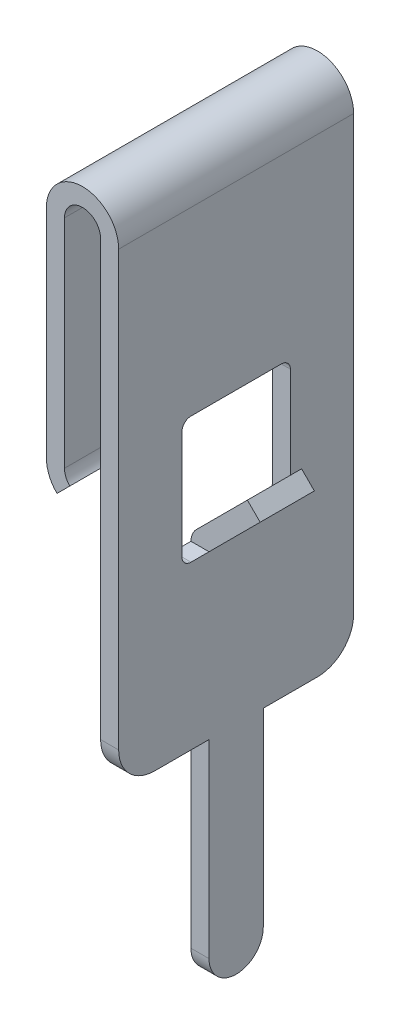
ISO-10303-21;
HEADER;
FILE_DESCRIPTION(('STEP AP214'),'2;1');
FILE_NAME('part.step','',(''),(''),'','','');
FILE_SCHEMA(('AUTOMOTIVE_DESIGN { 1 0 10303 214 1 1 1 1 }'));
ENDSEC;
DATA;
#1=APPLICATION_CONTEXT('core data for automotive mechanical design processes');
#2=APPLICATION_PROTOCOL_DEFINITION('international standard','automotive_design',2000,#1);
#3=PRODUCT_CONTEXT('',#1,'mechanical');
#4=PRODUCT('Part','Part','',(#3));
#5=PRODUCT_RELATED_PRODUCT_CATEGORY('part','',(#4));
#6=PRODUCT_DEFINITION_FORMATION('','',#4);
#7=PRODUCT_DEFINITION_CONTEXT('part definition',#1,'design');
#8=PRODUCT_DEFINITION('design','',#6,#7);
#9=PRODUCT_DEFINITION_SHAPE('','',#8);
#10=(LENGTH_UNIT() NAMED_UNIT(*) SI_UNIT(.MILLI.,.METRE.));
#11=(NAMED_UNIT(*) PLANE_ANGLE_UNIT() SI_UNIT($,.RADIAN.));
#12=(NAMED_UNIT(*) SI_UNIT($,.STERADIAN.) SOLID_ANGLE_UNIT());
#13=UNCERTAINTY_MEASURE_WITH_UNIT(LENGTH_MEASURE(1.E-05),#10,'distance_accuracy_value','');
#14=(GEOMETRIC_REPRESENTATION_CONTEXT(3) GLOBAL_UNCERTAINTY_ASSIGNED_CONTEXT((#13)) GLOBAL_UNIT_ASSIGNED_CONTEXT((#10,
#11,#12)) REPRESENTATION_CONTEXT('',''));
#15=CARTESIAN_POINT('',(0.,0.,0.));
#16=DIRECTION('',(0.,0.,1.));
#17=DIRECTION('',(1.,0.,0.));
#18=AXIS2_PLACEMENT_3D('',#15,#16,#17);
#19=CARTESIAN_POINT('',(0.,11.2071067811865,6.5));
#20=DIRECTION('',(-1.,0.,0.));
#21=DIRECTION('',(0.,-1.,0.));
#22=AXIS2_PLACEMENT_3D('',#19,#20,#21);
#23=PLANE('',#22);
#24=CARTESIAN_POINT('',(0.,7.,1.));
#25=DIRECTION('',(-1.,0.,0.));
#26=DIRECTION('',(0.,0.,1.));
#27=AXIS2_PLACEMENT_3D('',#24,#25,#26);
#28=CIRCLE('',#27,1.);
#29=CARTESIAN_POINT('',(0.,6.,1.));
#30=VERTEX_POINT('',#29);
#31=CARTESIAN_POINT('',(0.,7.,0.));
#32=VERTEX_POINT('',#31);
#33=EDGE_CURVE('E269',#30,#32,#28,.F.);
#34=ORIENTED_EDGE('',*,*,#33,.T.);
#35=DIRECTION('',(0.,1.,0.));
#36=VECTOR('',#35,1.);
#37=CARTESIAN_POINT('',(0.,11.2071067811865,0.));
#38=LINE('',#37,#36);
#39=CARTESIAN_POINT('',(0.,19.,0.));
#40=VERTEX_POINT('',#39);
#41=EDGE_CURVE('E274',#32,#40,#38,.T.);
#42=ORIENTED_EDGE('',*,*,#41,.T.);
#43=DIRECTION('',(0.,0.,-1.));
#44=VECTOR('',#43,1.);
#45=CARTESIAN_POINT('',(0.,19.,6.5));
#46=LINE('',#45,#44);
#47=CARTESIAN_POINT('',(0.,19.,6.5));
#48=VERTEX_POINT('',#47);
#49=EDGE_CURVE('E324',#48,#40,#46,.T.);
#50=ORIENTED_EDGE('',*,*,#49,.F.);
#51=DIRECTION('',(0.,1.,0.));
#52=VECTOR('',#51,1.);
#53=CARTESIAN_POINT('',(0.,11.2071067811865,6.5));
#54=LINE('',#53,#52);
#55=CARTESIAN_POINT('',(0.,7.,6.5));
#56=VERTEX_POINT('',#55);
#57=EDGE_CURVE('E365',#56,#48,#54,.T.);
#58=ORIENTED_EDGE('',*,*,#57,.F.);
#59=CARTESIAN_POINT('',(0.,7.,5.5));
#60=DIRECTION('',(-1.,0.,0.));
#61=DIRECTION('',(0.,0.,1.));
#62=AXIS2_PLACEMENT_3D('',#59,#60,#61);
#63=CIRCLE('',#62,1.);
#64=CARTESIAN_POINT('',(0.,6.,5.5));
#65=VERTEX_POINT('',#64);
#66=EDGE_CURVE('E383',#56,#65,#63,.F.);
#67=ORIENTED_EDGE('',*,*,#66,.T.);
#68=DIRECTION('',(0.,0.,-1.));
#69=VECTOR('',#68,1.);
#70=CARTESIAN_POINT('',(0.,6.,6.50000000000001));
#71=LINE('',#70,#69);
#72=CARTESIAN_POINT('',(0.,6.,4.));
#73=VERTEX_POINT('',#72);
#74=EDGE_CURVE('E424',#65,#73,#71,.T.);
#75=ORIENTED_EDGE('',*,*,#74,.T.);
#76=DIRECTION('',(0.,-1.,0.));
#77=VECTOR('',#76,1.);
#78=CARTESIAN_POINT('',(0.,0.,4.));
#79=LINE('',#78,#77);
#80=CARTESIAN_POINT('',(0.,0.749999999999999,4.));
#81=VERTEX_POINT('',#80);
#82=EDGE_CURVE('E420',#73,#81,#79,.T.);
#83=ORIENTED_EDGE('',*,*,#82,.T.);
#84=CARTESIAN_POINT('',(0.,0.749999999999999,3.25));
#85=DIRECTION('',(-1.,0.,0.));
#86=DIRECTION('',(0.,0.,1.));
#87=AXIS2_PLACEMENT_3D('',#84,#85,#86);
#88=CIRCLE('',#87,0.75);
#89=CARTESIAN_POINT('',(0.,0.749999999999999,2.5));
#90=VERTEX_POINT('',#89);
#91=EDGE_CURVE('E419',#81,#90,#88,.F.);
#92=ORIENTED_EDGE('',*,*,#91,.T.);
#93=DIRECTION('',(0.,1.,0.));
#94=VECTOR('',#93,1.);
#95=CARTESIAN_POINT('',(0.,0.,2.5));
#96=LINE('',#95,#94);
#97=CARTESIAN_POINT('',(0.,6.,2.5));
#98=VERTEX_POINT('',#97);
#99=EDGE_CURVE('E415',#90,#98,#96,.T.);
#100=ORIENTED_EDGE('',*,*,#99,.T.);
#101=DIRECTION('',(0.,0.,-1.));
#102=VECTOR('',#101,1.);
#103=CARTESIAN_POINT('',(0.,6.,6.49999999999999));
#104=LINE('',#103,#102);
#105=EDGE_CURVE('E380',#98,#30,#104,.T.);
#106=ORIENTED_EDGE('',*,*,#105,.T.);
#107=EDGE_LOOP('',(#34,#42,#50,#58,#67,#75,#83,#92,#100,#106));
#108=FACE_BOUND('',#107,.T.);
#109=DIRECTION('',(0.,0.,-1.));
#110=VECTOR('',#109,1.);
#111=CARTESIAN_POINT('',(0.,10.5,6.5));
#112=LINE('',#111,#110);
#113=CARTESIAN_POINT('',(0.,10.5,4.));
#114=VERTEX_POINT('',#113);
#115=CARTESIAN_POINT('',(0.,10.5,2.5));
#116=VERTEX_POINT('',#115);
#117=EDGE_CURVE('E242',#114,#116,#112,.T.);
#118=ORIENTED_EDGE('',*,*,#117,.F.);
#119=DIRECTION('',(0.,0.,-1.));
#120=VECTOR('',#119,1.);
#121=CARTESIAN_POINT('',(0.,10.5,3.25));
#122=LINE('',#121,#120);
#123=CARTESIAN_POINT('',(0.,10.5,4.5));
#124=VERTEX_POINT('',#123);
#125=EDGE_CURVE('E262',#124,#114,#122,.T.);
#126=ORIENTED_EDGE('',*,*,#125,.F.);
#127=CARTESIAN_POINT('',(0.,10.75,4.5));
#128=DIRECTION('',(1.,0.,0.));
#129=DIRECTION('',(0.,-1.,0.));
#130=AXIS2_PLACEMENT_3D('',#127,#128,#129);
#131=CIRCLE('',#130,0.25);
#132=CARTESIAN_POINT('',(0.,10.75,4.75));
#133=VERTEX_POINT('',#132);
#134=EDGE_CURVE('E498',#133,#124,#131,.T.);
#135=ORIENTED_EDGE('',*,*,#134,.F.);
#136=DIRECTION('',(0.,-1.,0.));
#137=VECTOR('',#136,1.);
#138=CARTESIAN_POINT('',(0.,10.75,4.75));
#139=LINE('',#138,#137);
#140=CARTESIAN_POINT('',(0.,13.75,4.75));
#141=VERTEX_POINT('',#140);
#142=EDGE_CURVE('E494',#141,#133,#139,.T.);
#143=ORIENTED_EDGE('',*,*,#142,.F.);
#144=CARTESIAN_POINT('',(0.,13.75,4.5));
#145=DIRECTION('',(1.,0.,0.));
#146=DIRECTION('',(0.,-1.,0.));
#147=AXIS2_PLACEMENT_3D('',#144,#145,#146);
#148=CIRCLE('',#147,0.25);
#149=CARTESIAN_POINT('',(0.,14.,4.5));
#150=VERTEX_POINT('',#149);
#151=EDGE_CURVE('E490',#150,#141,#148,.T.);
#152=ORIENTED_EDGE('',*,*,#151,.F.);
#153=DIRECTION('',(0.,0.,1.));
#154=VECTOR('',#153,1.);
#155=CARTESIAN_POINT('',(0.,14.,2.));
#156=LINE('',#155,#154);
#157=CARTESIAN_POINT('',(0.,14.,2.));
#158=VERTEX_POINT('',#157);
#159=EDGE_CURVE('E486',#158,#150,#156,.T.);
#160=ORIENTED_EDGE('',*,*,#159,.F.);
#161=CARTESIAN_POINT('',(0.,13.75,2.));
#162=DIRECTION('',(1.,0.,0.));
#163=DIRECTION('',(0.,1.,0.));
#164=AXIS2_PLACEMENT_3D('',#161,#162,#163);
#165=CIRCLE('',#164,0.25);
#166=CARTESIAN_POINT('',(0.,13.75,1.75));
#167=VERTEX_POINT('',#166);
#168=EDGE_CURVE('E482',#167,#158,#165,.T.);
#169=ORIENTED_EDGE('',*,*,#168,.F.);
#170=DIRECTION('',(0.,1.,0.));
#171=VECTOR('',#170,1.);
#172=CARTESIAN_POINT('',(0.,10.75,1.75));
#173=LINE('',#172,#171);
#174=CARTESIAN_POINT('',(0.,10.75,1.75));
#175=VERTEX_POINT('',#174);
#176=EDGE_CURVE('E478',#175,#167,#173,.T.);
#177=ORIENTED_EDGE('',*,*,#176,.F.);
#178=CARTESIAN_POINT('',(0.,10.75,2.));
#179=DIRECTION('',(1.,0.,0.));
#180=DIRECTION('',(0.,1.,0.));
#181=AXIS2_PLACEMENT_3D('',#178,#179,#180);
#182=CIRCLE('',#181,0.25);
#183=CARTESIAN_POINT('',(0.,10.5,2.));
#184=VERTEX_POINT('',#183);
#185=EDGE_CURVE('E257',#184,#175,#182,.T.);
#186=ORIENTED_EDGE('',*,*,#185,.F.);
#187=EDGE_CURVE('E254',#116,#184,#122,.T.);
#188=ORIENTED_EDGE('',*,*,#187,.F.);
#189=EDGE_LOOP('',(#118,#126,#135,#143,#152,#160,#169,#177,#186,#188));
#190=FACE_BOUND('',#189,.T.);
#191=ADVANCED_FACE('F39',(#108,#190),#23,.F.);
#192=CARTESIAN_POINT('',(-0.6,10.5,3.25));
#193=DIRECTION('',(0.,-1.,0.));
#194=DIRECTION('',(1.,0.,0.));
#195=AXIS2_PLACEMENT_3D('',#192,#193,#194);
#196=PLANE('',#195);
#197=DIRECTION('',(1.,0.,0.));
#198=VECTOR('',#197,1.);
#199=CARTESIAN_POINT('',(-0.5,10.5,2.5));
#200=LINE('',#199,#198);
#201=CARTESIAN_POINT('',(-0.5,10.5,2.5));
#202=VERTEX_POINT('',#201);
#203=EDGE_CURVE('E232',#202,#116,#200,.T.);
#204=ORIENTED_EDGE('',*,*,#203,.T.);
#205=ORIENTED_EDGE('',*,*,#187,.T.);
#206=DIRECTION('',(1.,0.,0.));
#207=VECTOR('',#206,1.);
#208=CARTESIAN_POINT('',(-0.6,10.5,2.));
#209=LINE('',#208,#207);
#210=CARTESIAN_POINT('',(-0.5,10.5,2.));
#211=VERTEX_POINT('',#210);
#212=EDGE_CURVE('E475',#211,#184,#209,.T.);
#213=ORIENTED_EDGE('',*,*,#212,.F.);
#214=DIRECTION('',(0.,0.,-1.));
#215=VECTOR('',#214,1.);
#216=CARTESIAN_POINT('',(-0.5,10.5,6.5));
#217=LINE('',#216,#215);
#218=EDGE_CURVE('E267',#202,#211,#217,.T.);
#219=ORIENTED_EDGE('',*,*,#218,.F.);
#220=EDGE_LOOP('',(#204,#205,#213,#219));
#221=FACE_BOUND('',#220,.T.);
#222=ADVANCED_FACE('F266',(#221),#196,.F.);
#223=DIRECTION('',(1.,0.,0.));
#224=VECTOR('',#223,1.);
#225=CARTESIAN_POINT('',(-0.5,10.5,4.));
#226=LINE('',#225,#224);
#227=CARTESIAN_POINT('',(-0.5,10.5,4.));
#228=VERTEX_POINT('',#227);
#229=EDGE_CURVE('E250',#228,#114,#226,.T.);
#230=ORIENTED_EDGE('',*,*,#229,.F.);
#231=CARTESIAN_POINT('',(-0.5,10.5,4.5));
#232=VERTEX_POINT('',#231);
#233=EDGE_CURVE('E309',#232,#228,#217,.T.);
#234=ORIENTED_EDGE('',*,*,#233,.F.);
#235=DIRECTION('',(1.,0.,0.));
#236=VECTOR('',#235,1.);
#237=CARTESIAN_POINT('',(-0.6,10.5,4.5));
#238=LINE('',#237,#236);
#239=EDGE_CURVE('E263',#232,#124,#238,.T.);
#240=ORIENTED_EDGE('',*,*,#239,.T.);
#241=ORIENTED_EDGE('',*,*,#125,.T.);
#242=EDGE_LOOP('',(#230,#234,#240,#241));
#243=FACE_BOUND('',#242,.T.);
#244=ADVANCED_FACE('F564',(#243),#196,.F.);
#245=CARTESIAN_POINT('',(-1.,19.,0.));
#246=DIRECTION('',(0.,0.,1.));
#247=DIRECTION('',(1.,0.,0.));
#248=AXIS2_PLACEMENT_3D('',#245,#246,#247);
#249=PLANE('',#248);
#250=ORIENTED_EDGE('',*,*,#41,.F.);
#251=DIRECTION('',(-1.,0.,0.));
#252=VECTOR('',#251,1.);
#253=CARTESIAN_POINT('',(1.5,7.,0.));
#254=LINE('',#253,#252);
#255=CARTESIAN_POINT('',(-0.5,7.,0.));
#256=VERTEX_POINT('',#255);
#257=EDGE_CURVE('E318',#256,#32,#254,.F.);
#258=ORIENTED_EDGE('',*,*,#257,.F.);
#259=DIRECTION('',(0.,-1.,0.));
#260=VECTOR('',#259,1.);
#261=CARTESIAN_POINT('',(-0.5,0.,0.));
#262=LINE('',#261,#260);
#263=CARTESIAN_POINT('',(-0.5,19.,0.));
#264=VERTEX_POINT('',#263);
#265=EDGE_CURVE('E361',#264,#256,#262,.T.);
#266=ORIENTED_EDGE('',*,*,#265,.F.);
#267=CARTESIAN_POINT('',(-1.,19.,0.));
#268=DIRECTION('',(0.,0.,-1.));
#269=DIRECTION('',(1.,0.,0.));
#270=AXIS2_PLACEMENT_3D('',#267,#268,#269);
#271=CIRCLE('',#270,0.5);
#272=CARTESIAN_POINT('',(-1.5,19.,0.));
#273=VERTEX_POINT('',#272);
#274=EDGE_CURVE('E354',#273,#264,#271,.T.);
#275=ORIENTED_EDGE('',*,*,#274,.F.);
#276=DIRECTION('',(0.,1.,0.));
#277=VECTOR('',#276,1.);
#278=CARTESIAN_POINT('',(-1.5,19.,0.));
#279=LINE('',#278,#277);
#280=CARTESIAN_POINT('',(-1.5,13.,0.));
#281=VERTEX_POINT('',#280);
#282=EDGE_CURVE('E349',#281,#273,#279,.T.);
#283=ORIENTED_EDGE('',*,*,#282,.F.);
#284=CARTESIAN_POINT('',(-1.,13.,0.));
#285=DIRECTION('',(0.,0.,-1.));
#286=DIRECTION('',(1.,0.,0.));
#287=AXIS2_PLACEMENT_3D('',#284,#285,#286);
#288=CIRCLE('',#287,0.499999999999999);
#289=CARTESIAN_POINT('',(-1.35355339059327,12.6464466094067,0.));
#290=VERTEX_POINT('',#289);
#291=EDGE_CURVE('E344',#290,#281,#288,.T.);
#292=ORIENTED_EDGE('',*,*,#291,.F.);
#293=DIRECTION('',(0.707106781186547,0.707106781186548,0.));
#294=VECTOR('',#293,1.);
#295=CARTESIAN_POINT('',(-1.70710678118655,12.2928932188135,0.));
#296=LINE('',#295,#294);
#297=CARTESIAN_POINT('',(-1.70710678118655,12.2928932188135,0.));
#298=VERTEX_POINT('',#297);
#299=EDGE_CURVE('E339',#298,#290,#296,.T.);
#300=ORIENTED_EDGE('',*,*,#299,.F.);
#301=CARTESIAN_POINT('',(-1.,13.,0.));
#302=DIRECTION('',(0.,0.,1.));
#303=DIRECTION('',(1.,0.,0.));
#304=AXIS2_PLACEMENT_3D('',#301,#302,#303);
#305=CIRCLE('',#304,0.999999999999999);
#306=CARTESIAN_POINT('',(-2.,13.,0.));
#307=VERTEX_POINT('',#306);
#308=EDGE_CURVE('E334',#307,#298,#305,.T.);
#309=ORIENTED_EDGE('',*,*,#308,.F.);
#310=DIRECTION('',(0.,-1.,0.));
#311=VECTOR('',#310,1.);
#312=CARTESIAN_POINT('',(-2.,19.,0.));
#313=LINE('',#312,#311);
#314=CARTESIAN_POINT('',(-2.,19.,0.));
#315=VERTEX_POINT('',#314);
#316=EDGE_CURVE('E328',#315,#307,#313,.T.);
#317=ORIENTED_EDGE('',*,*,#316,.F.);
#318=CARTESIAN_POINT('',(-1.,19.,0.));
#319=DIRECTION('',(0.,0.,1.));
#320=DIRECTION('',(1.,0.,0.));
#321=AXIS2_PLACEMENT_3D('',#318,#319,#320);
#322=CIRCLE('',#321,1.);
#323=EDGE_CURVE('E329',#40,#315,#322,.T.);
#324=ORIENTED_EDGE('',*,*,#323,.F.);
#325=EDGE_LOOP('',(#250,#258,#266,#275,#283,#292,#300,#309,#317,#324));
#326=FACE_BOUND('',#325,.T.);
#327=ADVANCED_FACE('F614',(#326),#249,.F.);
#328=CARTESIAN_POINT('',(-1.,19.,6.5));
#329=DIRECTION('',(0.,0.,-1.));
#330=DIRECTION('',(-1.,0.,0.));
#331=AXIS2_PLACEMENT_3D('',#328,#329,#330);
#332=CYLINDRICAL_SURFACE('',#331,1.);
#333=ORIENTED_EDGE('',*,*,#323,.T.);
#334=DIRECTION('',(0.,0.,-1.));
#335=VECTOR('',#334,1.);
#336=CARTESIAN_POINT('',(-2.,19.,6.5));
#337=LINE('',#336,#335);
#338=CARTESIAN_POINT('',(-2.,19.,6.5));
#339=VERTEX_POINT('',#338);
#340=EDGE_CURVE('E330',#339,#315,#337,.T.);
#341=ORIENTED_EDGE('',*,*,#340,.F.);
#342=CARTESIAN_POINT('',(-1.,19.,6.5));
#343=DIRECTION('',(0.,0.,1.));
#344=DIRECTION('',(1.,0.,0.));
#345=AXIS2_PLACEMENT_3D('',#342,#343,#344);
#346=CIRCLE('',#345,1.);
#347=EDGE_CURVE('E407',#48,#339,#346,.T.);
#348=ORIENTED_EDGE('',*,*,#347,.F.);
#349=ORIENTED_EDGE('',*,*,#49,.T.);
#350=EDGE_LOOP('',(#333,#341,#348,#349));
#351=FACE_BOUND('',#350,.T.);
#352=ADVANCED_FACE('F610',(#351),#332,.T.);
#353=CARTESIAN_POINT('',(-2.,19.,6.5));
#354=DIRECTION('',(1.,0.,0.));
#355=DIRECTION('',(0.,1.,0.));
#356=AXIS2_PLACEMENT_3D('',#353,#354,#355);
#357=PLANE('',#356);
#358=ORIENTED_EDGE('',*,*,#316,.T.);
#359=DIRECTION('',(0.,0.,-1.));
#360=VECTOR('',#359,1.);
#361=CARTESIAN_POINT('',(-2.,13.,6.5));
#362=LINE('',#361,#360);
#363=CARTESIAN_POINT('',(-2.,13.,6.5));
#364=VERTEX_POINT('',#363);
#365=EDGE_CURVE('E335',#364,#307,#362,.T.);
#366=ORIENTED_EDGE('',*,*,#365,.F.);
#367=DIRECTION('',(0.,-1.,0.));
#368=VECTOR('',#367,1.);
#369=CARTESIAN_POINT('',(-2.,19.,6.5));
#370=LINE('',#369,#368);
#371=EDGE_CURVE('E404',#339,#364,#370,.T.);
#372=ORIENTED_EDGE('',*,*,#371,.F.);
#373=ORIENTED_EDGE('',*,*,#340,.T.);
#374=EDGE_LOOP('',(#358,#366,#372,#373));
#375=FACE_BOUND('',#374,.T.);
#376=ADVANCED_FACE('F613',(#375),#357,.F.);
#377=CARTESIAN_POINT('',(-1.,13.,6.5));
#378=DIRECTION('',(0.,0.,-1.));
#379=DIRECTION('',(-1.,0.,0.));
#380=AXIS2_PLACEMENT_3D('',#377,#378,#379);
#381=CYLINDRICAL_SURFACE('',#380,0.999999999999999);
#382=ORIENTED_EDGE('',*,*,#308,.T.);
#383=DIRECTION('',(0.,0.,-1.));
#384=VECTOR('',#383,1.);
#385=CARTESIAN_POINT('',(-1.70710678118655,12.2928932188135,6.5));
#386=LINE('',#385,#384);
#387=CARTESIAN_POINT('',(-1.70710678118655,12.2928932188135,6.5));
#388=VERTEX_POINT('',#387);
#389=EDGE_CURVE('E340',#388,#298,#386,.T.);
#390=ORIENTED_EDGE('',*,*,#389,.F.);
#391=CARTESIAN_POINT('',(-1.,13.,6.5));
#392=DIRECTION('',(0.,0.,1.));
#393=DIRECTION('',(1.,0.,0.));
#394=AXIS2_PLACEMENT_3D('',#391,#392,#393);
#395=CIRCLE('',#394,0.999999999999999);
#396=EDGE_CURVE('E401',#364,#388,#395,.T.);
#397=ORIENTED_EDGE('',*,*,#396,.F.);
#398=ORIENTED_EDGE('',*,*,#365,.T.);
#399=EDGE_LOOP('',(#382,#390,#397,#398));
#400=FACE_BOUND('',#399,.T.);
#401=ADVANCED_FACE('F618',(#400),#381,.T.);
#402=CARTESIAN_POINT('',(-1.70710678118655,12.2928932188135,6.5));
#403=DIRECTION('',(-0.707106781186548,0.707106781186547,0.));
#404=DIRECTION('',(-0.707106781186547,-0.707106781186548,0.));
#405=AXIS2_PLACEMENT_3D('',#402,#403,#404);
#406=PLANE('',#405);
#407=ORIENTED_EDGE('',*,*,#299,.T.);
#408=DIRECTION('',(0.,0.,-1.));
#409=VECTOR('',#408,1.);
#410=CARTESIAN_POINT('',(-1.35355339059327,12.6464466094067,6.5));
#411=LINE('',#410,#409);
#412=CARTESIAN_POINT('',(-1.35355339059327,12.6464466094067,6.5));
#413=VERTEX_POINT('',#412);
#414=EDGE_CURVE('E345',#413,#290,#411,.T.);
#415=ORIENTED_EDGE('',*,*,#414,.F.);
#416=DIRECTION('',(0.707106781186547,0.707106781186548,0.));
#417=VECTOR('',#416,1.);
#418=CARTESIAN_POINT('',(-1.70710678118655,12.2928932188135,6.5));
#419=LINE('',#418,#417);
#420=EDGE_CURVE('E398',#388,#413,#419,.T.);
#421=ORIENTED_EDGE('',*,*,#420,.F.);
#422=ORIENTED_EDGE('',*,*,#389,.T.);
#423=EDGE_LOOP('',(#407,#415,#421,#422));
#424=FACE_BOUND('',#423,.T.);
#425=ADVANCED_FACE('F622',(#424),#406,.F.);
#426=CARTESIAN_POINT('',(-1.,13.,6.5));
#427=DIRECTION('',(0.,0.,-1.));
#428=DIRECTION('',(-1.,0.,0.));
#429=AXIS2_PLACEMENT_3D('',#426,#427,#428);
#430=CYLINDRICAL_SURFACE('',#429,0.499999999999999);
#431=ORIENTED_EDGE('',*,*,#291,.T.);
#432=DIRECTION('',(0.,0.,-1.));
#433=VECTOR('',#432,1.);
#434=CARTESIAN_POINT('',(-1.5,13.,6.5));
#435=LINE('',#434,#433);
#436=CARTESIAN_POINT('',(-1.5,13.,6.5));
#437=VERTEX_POINT('',#436);
#438=EDGE_CURVE('E350',#437,#281,#435,.T.);
#439=ORIENTED_EDGE('',*,*,#438,.F.);
#440=CARTESIAN_POINT('',(-1.,13.,6.5));
#441=DIRECTION('',(0.,0.,-1.));
#442=DIRECTION('',(1.,0.,0.));
#443=AXIS2_PLACEMENT_3D('',#440,#441,#442);
#444=CIRCLE('',#443,0.499999999999999);
#445=EDGE_CURVE('E395',#413,#437,#444,.T.);
#446=ORIENTED_EDGE('',*,*,#445,.F.);
#447=ORIENTED_EDGE('',*,*,#414,.T.);
#448=EDGE_LOOP('',(#431,#439,#446,#447));
#449=FACE_BOUND('',#448,.T.);
#450=ADVANCED_FACE('F626',(#449),#430,.F.);
#451=CARTESIAN_POINT('',(-1.5,19.,6.5));
#452=DIRECTION('',(-1.,0.,0.));
#453=DIRECTION('',(0.,-1.,0.));
#454=AXIS2_PLACEMENT_3D('',#451,#452,#453);
#455=PLANE('',#454);
#456=ORIENTED_EDGE('',*,*,#282,.T.);
#457=DIRECTION('',(0.,0.,-1.));
#458=VECTOR('',#457,1.);
#459=CARTESIAN_POINT('',(-1.5,19.,6.5));
#460=LINE('',#459,#458);
#461=CARTESIAN_POINT('',(-1.5,19.,6.5));
#462=VERTEX_POINT('',#461);
#463=EDGE_CURVE('E287',#462,#273,#460,.T.);
#464=ORIENTED_EDGE('',*,*,#463,.F.);
#465=DIRECTION('',(0.,1.,0.));
#466=VECTOR('',#465,1.);
#467=CARTESIAN_POINT('',(-1.5,19.,6.5));
#468=LINE('',#467,#466);
#469=EDGE_CURVE('E392',#437,#462,#468,.T.);
#470=ORIENTED_EDGE('',*,*,#469,.F.);
#471=ORIENTED_EDGE('',*,*,#438,.T.);
#472=EDGE_LOOP('',(#456,#464,#470,#471));
#473=FACE_BOUND('',#472,.T.);
#474=ADVANCED_FACE('F630',(#473),#455,.F.);
#475=CARTESIAN_POINT('',(-1.,19.,6.5));
#476=DIRECTION('',(0.,0.,-1.));
#477=DIRECTION('',(-1.,0.,0.));
#478=AXIS2_PLACEMENT_3D('',#475,#476,#477);
#479=CYLINDRICAL_SURFACE('',#478,0.5);
#480=ORIENTED_EDGE('',*,*,#274,.T.);
#481=DIRECTION('',(0.,0.,-1.));
#482=VECTOR('',#481,1.);
#483=CARTESIAN_POINT('',(-0.5,19.,6.5));
#484=LINE('',#483,#482);
#485=CARTESIAN_POINT('',(-0.5,19.,6.5));
#486=VERTEX_POINT('',#485);
#487=EDGE_CURVE('E292',#486,#264,#484,.T.);
#488=ORIENTED_EDGE('',*,*,#487,.F.);
#489=CARTESIAN_POINT('',(-1.,19.,6.5));
#490=DIRECTION('',(0.,0.,-1.));
#491=DIRECTION('',(1.,0.,0.));
#492=AXIS2_PLACEMENT_3D('',#489,#490,#491);
#493=CIRCLE('',#492,0.5);
#494=EDGE_CURVE('E389',#462,#486,#493,.T.);
#495=ORIENTED_EDGE('',*,*,#494,.F.);
#496=ORIENTED_EDGE('',*,*,#463,.T.);
#497=EDGE_LOOP('',(#480,#488,#495,#496));
#498=FACE_BOUND('',#497,.T.);
#499=ADVANCED_FACE('F634',(#498),#479,.F.);
#500=CARTESIAN_POINT('',(-0.5,0.,6.5));
#501=DIRECTION('',(1.,0.,0.));
#502=DIRECTION('',(0.,0.,-1.));
#503=AXIS2_PLACEMENT_3D('',#500,#501,#502);
#504=PLANE('',#503);
#505=ORIENTED_EDGE('',*,*,#233,.T.);
#506=DIRECTION('',(0.,0.,-1.));
#507=VECTOR('',#506,1.);
#508=CARTESIAN_POINT('',(-0.5,10.5,6.5));
#509=LINE('',#508,#507);
#510=EDGE_CURVE('E524',#228,#202,#509,.T.);
#511=ORIENTED_EDGE('',*,*,#510,.T.);
#512=ORIENTED_EDGE('',*,*,#218,.T.);
#513=CARTESIAN_POINT('',(-0.5,10.75,2.));
#514=DIRECTION('',(1.,0.,0.));
#515=DIRECTION('',(0.,0.,-1.));
#516=AXIS2_PLACEMENT_3D('',#513,#514,#515);
#517=CIRCLE('',#516,0.25);
#518=CARTESIAN_POINT('',(-0.5,10.75,1.75));
#519=VERTEX_POINT('',#518);
#520=EDGE_CURVE('E305',#211,#519,#517,.T.);
#521=ORIENTED_EDGE('',*,*,#520,.T.);
#522=DIRECTION('',(0.,1.,0.));
#523=VECTOR('',#522,1.);
#524=CARTESIAN_POINT('',(-0.5,0.,1.75));
#525=LINE('',#524,#523);
#526=CARTESIAN_POINT('',(-0.5,13.75,1.75));
#527=VERTEX_POINT('',#526);
#528=EDGE_CURVE('E301',#519,#527,#525,.T.);
#529=ORIENTED_EDGE('',*,*,#528,.T.);
#530=CARTESIAN_POINT('',(-0.5,13.75,2.));
#531=DIRECTION('',(1.,0.,0.));
#532=DIRECTION('',(0.,0.,-1.));
#533=AXIS2_PLACEMENT_3D('',#530,#531,#532);
#534=CIRCLE('',#533,0.25);
#535=CARTESIAN_POINT('',(-0.5,14.,2.));
#536=VERTEX_POINT('',#535);
#537=EDGE_CURVE('E297',#527,#536,#534,.T.);
#538=ORIENTED_EDGE('',*,*,#537,.T.);
#539=DIRECTION('',(0.,0.,1.));
#540=VECTOR('',#539,1.);
#541=CARTESIAN_POINT('',(-0.5,14.,6.5));
#542=LINE('',#541,#540);
#543=CARTESIAN_POINT('',(-0.5,14.,4.5));
#544=VERTEX_POINT('',#543);
#545=EDGE_CURVE('E293',#536,#544,#542,.T.);
#546=ORIENTED_EDGE('',*,*,#545,.T.);
#547=CARTESIAN_POINT('',(-0.5,13.75,4.5));
#548=DIRECTION('',(1.,0.,0.));
#549=DIRECTION('',(0.,0.,-1.));
#550=AXIS2_PLACEMENT_3D('',#547,#548,#549);
#551=CIRCLE('',#550,0.25);
#552=CARTESIAN_POINT('',(-0.5,13.75,4.75));
#553=VERTEX_POINT('',#552);
#554=EDGE_CURVE('E288',#544,#553,#551,.T.);
#555=ORIENTED_EDGE('',*,*,#554,.T.);
#556=DIRECTION('',(0.,-1.,0.));
#557=VECTOR('',#556,1.);
#558=CARTESIAN_POINT('',(-0.5,0.,4.75));
#559=LINE('',#558,#557);
#560=CARTESIAN_POINT('',(-0.5,10.75,4.75));
#561=VERTEX_POINT('',#560);
#562=EDGE_CURVE('E283',#553,#561,#559,.T.);
#563=ORIENTED_EDGE('',*,*,#562,.T.);
#564=CARTESIAN_POINT('',(-0.5,10.75,4.5));
#565=DIRECTION('',(1.,0.,0.));
#566=DIRECTION('',(0.,0.,-1.));
#567=AXIS2_PLACEMENT_3D('',#564,#565,#566);
#568=CIRCLE('',#567,0.25);
#569=EDGE_CURVE('E279',#561,#232,#568,.T.);
#570=ORIENTED_EDGE('',*,*,#569,.T.);
#571=EDGE_LOOP('',(#505,#511,#512,#521,#529,#538,#546,#555,#563,#570));
#572=FACE_BOUND('',#571,.T.);
#573=DIRECTION('',(0.,0.,-1.));
#574=VECTOR('',#573,1.);
#575=CARTESIAN_POINT('',(-0.5,6.,4.));
#576=LINE('',#575,#574);
#577=CARTESIAN_POINT('',(-0.5,6.,5.5));
#578=VERTEX_POINT('',#577);
#579=CARTESIAN_POINT('',(-0.5,6.,4.));
#580=VERTEX_POINT('',#579);
#581=EDGE_CURVE('E436',#578,#580,#576,.T.);
#582=ORIENTED_EDGE('',*,*,#581,.F.);
#583=CARTESIAN_POINT('',(-0.5,7.,5.5));
#584=DIRECTION('',(1.,0.,0.));
#585=DIRECTION('',(0.,0.,1.));
#586=AXIS2_PLACEMENT_3D('',#583,#584,#585);
#587=CIRCLE('',#586,1.);
#588=CARTESIAN_POINT('',(-0.5,7.,6.5));
#589=VERTEX_POINT('',#588);
#590=EDGE_CURVE('E316',#589,#578,#587,.T.);
#591=ORIENTED_EDGE('',*,*,#590,.F.);
#592=DIRECTION('',(0.,-1.,0.));
#593=VECTOR('',#592,1.);
#594=CARTESIAN_POINT('',(-0.5,0.,6.5));
#595=LINE('',#594,#593);
#596=EDGE_CURVE('E384',#486,#589,#595,.T.);
#597=ORIENTED_EDGE('',*,*,#596,.F.);
#598=ORIENTED_EDGE('',*,*,#487,.T.);
#599=ORIENTED_EDGE('',*,*,#265,.T.);
#600=CARTESIAN_POINT('',(-0.5,7.,1.));
#601=DIRECTION('',(1.,0.,0.));
#602=DIRECTION('',(0.,0.,1.));
#603=AXIS2_PLACEMENT_3D('',#600,#601,#602);
#604=CIRCLE('',#603,1.);
#605=CARTESIAN_POINT('',(-0.5,6.,1.));
#606=VERTEX_POINT('',#605);
#607=EDGE_CURVE('E323',#606,#256,#604,.T.);
#608=ORIENTED_EDGE('',*,*,#607,.F.);
#609=DIRECTION('',(0.,0.,-1.));
#610=VECTOR('',#609,1.);
#611=CARTESIAN_POINT('',(-0.5,6.,1.));
#612=LINE('',#611,#610);
#613=CARTESIAN_POINT('',(-0.5,6.,2.5));
#614=VERTEX_POINT('',#613);
#615=EDGE_CURVE('E449',#614,#606,#612,.T.);
#616=ORIENTED_EDGE('',*,*,#615,.F.);
#617=DIRECTION('',(0.,1.,0.));
#618=VECTOR('',#617,1.);
#619=CARTESIAN_POINT('',(-0.5,0.749999999999999,2.5));
#620=LINE('',#619,#618);
#621=CARTESIAN_POINT('',(-0.5,0.749999999999999,2.5));
#622=VERTEX_POINT('',#621);
#623=EDGE_CURVE('E441',#622,#614,#620,.T.);
#624=ORIENTED_EDGE('',*,*,#623,.F.);
#625=CARTESIAN_POINT('',(-0.5,0.749999999999999,3.25));
#626=DIRECTION('',(1.,0.,0.));
#627=DIRECTION('',(0.,0.,1.));
#628=AXIS2_PLACEMENT_3D('',#625,#626,#627);
#629=CIRCLE('',#628,0.75);
#630=CARTESIAN_POINT('',(-0.5,0.749999999999999,4.));
#631=VERTEX_POINT('',#630);
#632=EDGE_CURVE('E317',#631,#622,#629,.T.);
#633=ORIENTED_EDGE('',*,*,#632,.F.);
#634=DIRECTION('',(0.,-1.,0.));
#635=VECTOR('',#634,1.);
#636=CARTESIAN_POINT('',(-0.5,0.749999999999999,4.));
#637=LINE('',#636,#635);
#638=EDGE_CURVE('E437',#580,#631,#637,.T.);
#639=ORIENTED_EDGE('',*,*,#638,.F.);
#640=EDGE_LOOP('',(#582,#591,#597,#598,#599,#608,#616,#624,#633,#639));
#641=FACE_BOUND('',#640,.T.);
#642=ADVANCED_FACE('F532',(#572,#641),#504,.F.);
#643=CARTESIAN_POINT('',(-1.,19.,6.5));
#644=DIRECTION('',(0.,0.,1.));
#645=DIRECTION('',(1.,0.,0.));
#646=AXIS2_PLACEMENT_3D('',#643,#644,#645);
#647=PLANE('',#646);
#648=DIRECTION('',(-1.,0.,0.));
#649=VECTOR('',#648,1.);
#650=CARTESIAN_POINT('',(-1.,7.,6.5));
#651=LINE('',#650,#649);
#652=EDGE_CURVE('E313',#56,#589,#651,.T.);
#653=ORIENTED_EDGE('',*,*,#652,.F.);
#654=ORIENTED_EDGE('',*,*,#57,.T.);
#655=ORIENTED_EDGE('',*,*,#347,.T.);
#656=ORIENTED_EDGE('',*,*,#371,.T.);
#657=ORIENTED_EDGE('',*,*,#396,.T.);
#658=ORIENTED_EDGE('',*,*,#420,.T.);
#659=ORIENTED_EDGE('',*,*,#445,.T.);
#660=ORIENTED_EDGE('',*,*,#469,.T.);
#661=ORIENTED_EDGE('',*,*,#494,.T.);
#662=ORIENTED_EDGE('',*,*,#596,.T.);
#663=EDGE_LOOP('',(#653,#654,#655,#656,#657,#658,#659,#660,#661,#662));
#664=FACE_BOUND('',#663,.T.);
#665=ADVANCED_FACE('F641',(#664),#647,.T.);
#666=CARTESIAN_POINT('',(1.5,6.,1.));
#667=DIRECTION('',(0.,1.,0.));
#668=DIRECTION('',(0.,0.,1.));
#669=AXIS2_PLACEMENT_3D('',#666,#667,#668);
#670=PLANE('',#669);
#671=DIRECTION('',(-1.,0.,0.));
#672=VECTOR('',#671,1.);
#673=CARTESIAN_POINT('',(1.5,6.,2.5));
#674=LINE('',#673,#672);
#675=EDGE_CURVE('E388',#98,#614,#674,.T.);
#676=ORIENTED_EDGE('',*,*,#675,.T.);
#677=ORIENTED_EDGE('',*,*,#615,.T.);
#678=DIRECTION('',(-1.,0.,0.));
#679=VECTOR('',#678,1.);
#680=CARTESIAN_POINT('',(1.5,6.,1.));
#681=LINE('',#680,#679);
#682=EDGE_CURVE('E452',#30,#606,#681,.T.);
#683=ORIENTED_EDGE('',*,*,#682,.F.);
#684=ORIENTED_EDGE('',*,*,#105,.F.);
#685=EDGE_LOOP('',(#676,#677,#683,#684));
#686=FACE_BOUND('',#685,.T.);
#687=ADVANCED_FACE('F647',(#686),#670,.F.);
#688=CARTESIAN_POINT('',(1.5,0.749999999999999,2.5));
#689=DIRECTION('',(0.,0.,1.));
#690=DIRECTION('',(1.,0.,0.));
#691=AXIS2_PLACEMENT_3D('',#688,#689,#690);
#692=PLANE('',#691);
#693=DIRECTION('',(-1.,0.,0.));
#694=VECTOR('',#693,1.);
#695=CARTESIAN_POINT('',(1.5,0.749999999999999,2.5));
#696=LINE('',#695,#694);
#697=EDGE_CURVE('E446',#90,#622,#696,.T.);
#698=ORIENTED_EDGE('',*,*,#697,.T.);
#699=ORIENTED_EDGE('',*,*,#623,.T.);
#700=ORIENTED_EDGE('',*,*,#675,.F.);
#701=ORIENTED_EDGE('',*,*,#99,.F.);
#702=EDGE_LOOP('',(#698,#699,#700,#701));
#703=FACE_BOUND('',#702,.T.);
#704=ADVANCED_FACE('F662',(#703),#692,.F.);
#705=CARTESIAN_POINT('',(1.5,0.749999999999999,4.));
#706=DIRECTION('',(0.,0.,-1.));
#707=DIRECTION('',(-1.,0.,0.));
#708=AXIS2_PLACEMENT_3D('',#705,#706,#707);
#709=PLANE('',#708);
#710=DIRECTION('',(-1.,0.,0.));
#711=VECTOR('',#710,1.);
#712=CARTESIAN_POINT('',(1.5,6.,4.));
#713=LINE('',#712,#711);
#714=EDGE_CURVE('E438',#73,#580,#713,.T.);
#715=ORIENTED_EDGE('',*,*,#714,.T.);
#716=ORIENTED_EDGE('',*,*,#638,.T.);
#717=DIRECTION('',(-1.,0.,0.));
#718=VECTOR('',#717,1.);
#719=CARTESIAN_POINT('',(1.5,0.749999999999999,4.));
#720=LINE('',#719,#718);
#721=EDGE_CURVE('E442',#81,#631,#720,.T.);
#722=ORIENTED_EDGE('',*,*,#721,.F.);
#723=ORIENTED_EDGE('',*,*,#82,.F.);
#724=EDGE_LOOP('',(#715,#716,#722,#723));
#725=FACE_BOUND('',#724,.T.);
#726=ADVANCED_FACE('F658',(#725),#709,.F.);
#727=CARTESIAN_POINT('',(1.5,6.,4.));
#728=DIRECTION('',(0.,1.,0.));
#729=DIRECTION('',(0.,0.,1.));
#730=AXIS2_PLACEMENT_3D('',#727,#728,#729);
#731=PLANE('',#730);
#732=DIRECTION('',(-1.,0.,0.));
#733=VECTOR('',#732,1.);
#734=CARTESIAN_POINT('',(1.5,6.,5.5));
#735=LINE('',#734,#733);
#736=EDGE_CURVE('E433',#65,#578,#735,.T.);
#737=ORIENTED_EDGE('',*,*,#736,.T.);
#738=ORIENTED_EDGE('',*,*,#581,.T.);
#739=ORIENTED_EDGE('',*,*,#714,.F.);
#740=ORIENTED_EDGE('',*,*,#74,.F.);
#741=EDGE_LOOP('',(#737,#738,#739,#740));
#742=FACE_BOUND('',#741,.T.);
#743=ADVANCED_FACE('F655',(#742),#731,.F.);
#744=CARTESIAN_POINT('',(1.5,0.749999999999999,3.25));
#745=DIRECTION('',(-1.,0.,0.));
#746=DIRECTION('',(0.,0.,1.));
#747=AXIS2_PLACEMENT_3D('',#744,#745,#746);
#748=CYLINDRICAL_SURFACE('',#747,0.75);
#749=ORIENTED_EDGE('',*,*,#721,.T.);
#750=ORIENTED_EDGE('',*,*,#632,.T.);
#751=ORIENTED_EDGE('',*,*,#697,.F.);
#752=ORIENTED_EDGE('',*,*,#91,.F.);
#753=EDGE_LOOP('',(#749,#750,#751,#752));
#754=FACE_BOUND('',#753,.T.);
#755=ADVANCED_FACE('F653',(#754),#748,.T.);
#756=CARTESIAN_POINT('',(1.5,7.,5.5));
#757=DIRECTION('',(-1.,0.,0.));
#758=DIRECTION('',(0.,0.,1.));
#759=AXIS2_PLACEMENT_3D('',#756,#757,#758);
#760=CYLINDRICAL_SURFACE('',#759,1.);
#761=ORIENTED_EDGE('',*,*,#652,.T.);
#762=ORIENTED_EDGE('',*,*,#590,.T.);
#763=ORIENTED_EDGE('',*,*,#736,.F.);
#764=ORIENTED_EDGE('',*,*,#66,.F.);
#765=EDGE_LOOP('',(#761,#762,#763,#764));
#766=FACE_BOUND('',#765,.T.);
#767=ADVANCED_FACE('F649',(#766),#760,.T.);
#768=CARTESIAN_POINT('',(1.5,7.,1.));
#769=DIRECTION('',(-1.,0.,0.));
#770=DIRECTION('',(0.,0.,1.));
#771=AXIS2_PLACEMENT_3D('',#768,#769,#770);
#772=CYLINDRICAL_SURFACE('',#771,1.);
#773=ORIENTED_EDGE('',*,*,#682,.T.);
#774=ORIENTED_EDGE('',*,*,#607,.T.);
#775=ORIENTED_EDGE('',*,*,#257,.T.);
#776=ORIENTED_EDGE('',*,*,#33,.F.);
#777=EDGE_LOOP('',(#773,#774,#775,#776));
#778=FACE_BOUND('',#777,.T.);
#779=ADVANCED_FACE('F652',(#778),#772,.T.);
#780=CARTESIAN_POINT('',(-0.6,10.75,4.5));
#781=DIRECTION('',(1.,0.,0.));
#782=DIRECTION('',(0.,1.,0.));
#783=AXIS2_PLACEMENT_3D('',#780,#781,#782);
#784=CYLINDRICAL_SURFACE('',#783,0.25);
#785=DIRECTION('',(1.,0.,0.));
#786=VECTOR('',#785,1.);
#787=CARTESIAN_POINT('',(-0.6,10.75,4.75));
#788=LINE('',#787,#786);
#789=EDGE_CURVE('E322',#561,#133,#788,.T.);
#790=ORIENTED_EDGE('',*,*,#789,.T.);
#791=ORIENTED_EDGE('',*,*,#134,.T.);
#792=ORIENTED_EDGE('',*,*,#239,.F.);
#793=ORIENTED_EDGE('',*,*,#569,.F.);
#794=EDGE_LOOP('',(#790,#791,#792,#793));
#795=FACE_BOUND('',#794,.T.);
#796=ADVANCED_FACE('F560',(#795),#784,.F.);
#797=CARTESIAN_POINT('',(-0.6,10.75,4.75));
#798=DIRECTION('',(0.,0.,1.));
#799=DIRECTION('',(1.,0.,0.));
#800=AXIS2_PLACEMENT_3D('',#797,#798,#799);
#801=PLANE('',#800);
#802=DIRECTION('',(1.,0.,0.));
#803=VECTOR('',#802,1.);
#804=CARTESIAN_POINT('',(-0.6,13.75,4.75));
#805=LINE('',#804,#803);
#806=EDGE_CURVE('E495',#553,#141,#805,.T.);
#807=ORIENTED_EDGE('',*,*,#806,.T.);
#808=ORIENTED_EDGE('',*,*,#142,.T.);
#809=ORIENTED_EDGE('',*,*,#789,.F.);
#810=ORIENTED_EDGE('',*,*,#562,.F.);
#811=EDGE_LOOP('',(#807,#808,#809,#810));
#812=FACE_BOUND('',#811,.T.);
#813=ADVANCED_FACE('F557',(#812),#801,.F.);
#814=CARTESIAN_POINT('',(-0.6,13.75,4.5));
#815=DIRECTION('',(1.,0.,0.));
#816=DIRECTION('',(0.,1.,0.));
#817=AXIS2_PLACEMENT_3D('',#814,#815,#816);
#818=CYLINDRICAL_SURFACE('',#817,0.25);
#819=DIRECTION('',(1.,0.,0.));
#820=VECTOR('',#819,1.);
#821=CARTESIAN_POINT('',(-0.6,14.,4.5));
#822=LINE('',#821,#820);
#823=EDGE_CURVE('E491',#544,#150,#822,.T.);
#824=ORIENTED_EDGE('',*,*,#823,.T.);
#825=ORIENTED_EDGE('',*,*,#151,.T.);
#826=ORIENTED_EDGE('',*,*,#806,.F.);
#827=ORIENTED_EDGE('',*,*,#554,.F.);
#828=EDGE_LOOP('',(#824,#825,#826,#827));
#829=FACE_BOUND('',#828,.T.);
#830=ADVANCED_FACE('F552',(#829),#818,.F.);
#831=CARTESIAN_POINT('',(-0.6,14.,2.));
#832=DIRECTION('',(0.,1.,0.));
#833=DIRECTION('',(-1.,0.,0.));
#834=AXIS2_PLACEMENT_3D('',#831,#832,#833);
#835=PLANE('',#834);
#836=DIRECTION('',(1.,0.,0.));
#837=VECTOR('',#836,1.);
#838=CARTESIAN_POINT('',(-0.6,14.,2.));
#839=LINE('',#838,#837);
#840=EDGE_CURVE('E487',#536,#158,#839,.T.);
#841=ORIENTED_EDGE('',*,*,#840,.T.);
#842=ORIENTED_EDGE('',*,*,#159,.T.);
#843=ORIENTED_EDGE('',*,*,#823,.F.);
#844=ORIENTED_EDGE('',*,*,#545,.F.);
#845=EDGE_LOOP('',(#841,#842,#843,#844));
#846=FACE_BOUND('',#845,.T.);
#847=ADVANCED_FACE('F548',(#846),#835,.F.);
#848=CARTESIAN_POINT('',(-0.6,13.75,2.));
#849=DIRECTION('',(1.,0.,0.));
#850=DIRECTION('',(0.,1.,0.));
#851=AXIS2_PLACEMENT_3D('',#848,#849,#850);
#852=CYLINDRICAL_SURFACE('',#851,0.25);
#853=DIRECTION('',(1.,0.,0.));
#854=VECTOR('',#853,1.);
#855=CARTESIAN_POINT('',(-0.6,13.75,1.75));
#856=LINE('',#855,#854);
#857=EDGE_CURVE('E483',#527,#167,#856,.T.);
#858=ORIENTED_EDGE('',*,*,#857,.T.);
#859=ORIENTED_EDGE('',*,*,#168,.T.);
#860=ORIENTED_EDGE('',*,*,#840,.F.);
#861=ORIENTED_EDGE('',*,*,#537,.F.);
#862=EDGE_LOOP('',(#858,#859,#860,#861));
#863=FACE_BOUND('',#862,.T.);
#864=ADVANCED_FACE('F545',(#863),#852,.F.);
#865=CARTESIAN_POINT('',(-0.6,10.75,1.75));
#866=DIRECTION('',(0.,0.,-1.));
#867=DIRECTION('',(-1.,0.,0.));
#868=AXIS2_PLACEMENT_3D('',#865,#866,#867);
#869=PLANE('',#868);
#870=DIRECTION('',(1.,0.,0.));
#871=VECTOR('',#870,1.);
#872=CARTESIAN_POINT('',(-0.6,10.75,1.75));
#873=LINE('',#872,#871);
#874=EDGE_CURVE('E479',#519,#175,#873,.T.);
#875=ORIENTED_EDGE('',*,*,#874,.T.);
#876=ORIENTED_EDGE('',*,*,#176,.T.);
#877=ORIENTED_EDGE('',*,*,#857,.F.);
#878=ORIENTED_EDGE('',*,*,#528,.F.);
#879=EDGE_LOOP('',(#875,#876,#877,#878));
#880=FACE_BOUND('',#879,.T.);
#881=ADVANCED_FACE('F540',(#880),#869,.F.);
#882=CARTESIAN_POINT('',(-0.6,10.75,2.));
#883=DIRECTION('',(1.,0.,0.));
#884=DIRECTION('',(0.,1.,0.));
#885=AXIS2_PLACEMENT_3D('',#882,#883,#884);
#886=CYLINDRICAL_SURFACE('',#885,0.25);
#887=ORIENTED_EDGE('',*,*,#212,.T.);
#888=ORIENTED_EDGE('',*,*,#185,.T.);
#889=ORIENTED_EDGE('',*,*,#874,.F.);
#890=ORIENTED_EDGE('',*,*,#520,.F.);
#891=EDGE_LOOP('',(#887,#888,#889,#890));
#892=FACE_BOUND('',#891,.T.);
#893=ADVANCED_FACE('F538',(#892),#886,.F.);
#894=CARTESIAN_POINT('',(-0.5,10.5,2.5));
#895=DIRECTION('',(0.,0.,1.));
#896=DIRECTION('',(1.,0.,0.));
#897=AXIS2_PLACEMENT_3D('',#894,#895,#896);
#898=PLANE('',#897);
#899=ORIENTED_EDGE('',*,*,#203,.F.);
#900=CARTESIAN_POINT('',(0.,10.5,2.5));
#901=DIRECTION('',(0.,0.,1.));
#902=DIRECTION('',(1.,0.,0.));
#903=AXIS2_PLACEMENT_3D('',#900,#901,#902);
#904=CIRCLE('',#903,0.5);
#905=CARTESIAN_POINT('',(-0.353553390593277,10.8535533905932,2.5));
#906=VERTEX_POINT('',#905);
#907=EDGE_CURVE('E62',#202,#906,#904,.F.);
#908=ORIENTED_EDGE('',*,*,#907,.T.);
#909=DIRECTION('',(-0.707106781186541,-0.707106781186554,0.));
#910=VECTOR('',#909,1.);
#911=CARTESIAN_POINT('',(1.06066017177982,12.2677669529664,2.5));
#912=LINE('',#911,#910);
#913=CARTESIAN_POINT('',(1.06066017177982,12.2677669529664,2.5));
#914=VERTEX_POINT('',#913);
#915=EDGE_CURVE('E588',#914,#906,#912,.T.);
#916=ORIENTED_EDGE('',*,*,#915,.F.);
#917=DIRECTION('',(-0.707106781186547,0.707106781186548,0.));
#918=VECTOR('',#917,1.);
#919=CARTESIAN_POINT('',(1.4142135623731,11.9142135623731,2.5));
#920=LINE('',#919,#918);
#921=CARTESIAN_POINT('',(1.4142135623731,11.9142135623731,2.5));
#922=VERTEX_POINT('',#921);
#923=EDGE_CURVE('E234',#922,#914,#920,.T.);
#924=ORIENTED_EDGE('',*,*,#923,.F.);
#925=DIRECTION('',(0.707106781186548,0.707106781186547,0.));
#926=VECTOR('',#925,1.);
#927=CARTESIAN_POINT('',(0.,10.5,2.5));
#928=LINE('',#927,#926);
#929=EDGE_CURVE('E228',#116,#922,#928,.T.);
#930=ORIENTED_EDGE('',*,*,#929,.F.);
#931=EDGE_LOOP('',(#899,#908,#916,#924,#930));
#932=FACE_BOUND('',#931,.T.);
#933=ADVANCED_FACE('F230',(#932),#898,.F.);
#934=CARTESIAN_POINT('',(-0.5,11.2071067811865,4.));
#935=DIRECTION('',(0.,0.,-1.));
#936=DIRECTION('',(-1.,0.,0.));
#937=AXIS2_PLACEMENT_3D('',#934,#935,#936);
#938=PLANE('',#937);
#939=DIRECTION('',(-0.707106781186541,-0.707106781186554,0.));
#940=VECTOR('',#939,1.);
#941=CARTESIAN_POINT('',(1.06066017177982,12.2677669529664,4.));
#942=LINE('',#941,#940);
#943=CARTESIAN_POINT('',(1.06066017177982,12.2677669529664,4.));
#944=VERTEX_POINT('',#943);
#945=CARTESIAN_POINT('',(-0.353553390593277,10.8535533905932,4.));
#946=VERTEX_POINT('',#945);
#947=EDGE_CURVE('E239',#944,#946,#942,.T.);
#948=ORIENTED_EDGE('',*,*,#947,.T.);
#949=CARTESIAN_POINT('',(0.,10.5,4.));
#950=DIRECTION('',(0.,0.,-1.));
#951=DIRECTION('',(-1.,0.,0.));
#952=AXIS2_PLACEMENT_3D('',#949,#950,#951);
#953=CIRCLE('',#952,0.5);
#954=EDGE_CURVE('E11',#946,#228,#953,.F.);
#955=ORIENTED_EDGE('',*,*,#954,.T.);
#956=ORIENTED_EDGE('',*,*,#229,.T.);
#957=DIRECTION('',(0.707106781186548,0.707106781186547,0.));
#958=VECTOR('',#957,1.);
#959=CARTESIAN_POINT('',(0.,10.5,4.));
#960=LINE('',#959,#958);
#961=CARTESIAN_POINT('',(1.4142135623731,11.9142135623731,4.));
#962=VERTEX_POINT('',#961);
#963=EDGE_CURVE('E245',#114,#962,#960,.T.);
#964=ORIENTED_EDGE('',*,*,#963,.T.);
#965=DIRECTION('',(-0.707106781186547,0.707106781186548,0.));
#966=VECTOR('',#965,1.);
#967=CARTESIAN_POINT('',(1.4142135623731,11.9142135623731,4.));
#968=LINE('',#967,#966);
#969=EDGE_CURVE('E570',#962,#944,#968,.T.);
#970=ORIENTED_EDGE('',*,*,#969,.T.);
#971=EDGE_LOOP('',(#948,#955,#956,#964,#970));
#972=FACE_BOUND('',#971,.T.);
#973=ADVANCED_FACE('F568',(#972),#938,.F.);
#974=CARTESIAN_POINT('',(1.4142135623731,11.9142135623731,6.5));
#975=DIRECTION('',(-0.707106781186548,-0.707106781186547,0.));
#976=DIRECTION('',(0.707106781186547,-0.707106781186548,0.));
#977=AXIS2_PLACEMENT_3D('',#974,#975,#976);
#978=PLANE('',#977);
#979=DIRECTION('',(0.,0.,-1.));
#980=VECTOR('',#979,1.);
#981=CARTESIAN_POINT('',(1.4142135623731,11.9142135623731,6.5));
#982=LINE('',#981,#980);
#983=EDGE_CURVE('E251',#962,#922,#982,.T.);
#984=ORIENTED_EDGE('',*,*,#983,.T.);
#985=ORIENTED_EDGE('',*,*,#923,.T.);
#986=DIRECTION('',(0.,0.,-1.));
#987=VECTOR('',#986,1.);
#988=CARTESIAN_POINT('',(1.06066017177982,12.2677669529664,6.5));
#989=LINE('',#988,#987);
#990=EDGE_CURVE('E581',#944,#914,#989,.T.);
#991=ORIENTED_EDGE('',*,*,#990,.F.);
#992=ORIENTED_EDGE('',*,*,#969,.F.);
#993=EDGE_LOOP('',(#984,#985,#991,#992));
#994=FACE_BOUND('',#993,.T.);
#995=ADVANCED_FACE('F586',(#994),#978,.F.);
#996=CARTESIAN_POINT('',(0.,10.5,6.5));
#997=DIRECTION('',(-0.707106781186547,0.707106781186548,0.));
#998=DIRECTION('',(-0.707106781186548,-0.707106781186547,0.));
#999=AXIS2_PLACEMENT_3D('',#996,#997,#998);
#1000=PLANE('',#999);
#1001=ORIENTED_EDGE('',*,*,#117,.T.);
#1002=ORIENTED_EDGE('',*,*,#929,.T.);
#1003=ORIENTED_EDGE('',*,*,#983,.F.);
#1004=ORIENTED_EDGE('',*,*,#963,.F.);
#1005=EDGE_LOOP('',(#1001,#1002,#1003,#1004));
#1006=FACE_BOUND('',#1005,.T.);
#1007=ADVANCED_FACE('F244',(#1006),#1000,.F.);
#1008=CARTESIAN_POINT('',(1.06066017177982,12.2677669529664,6.5));
#1009=DIRECTION('',(0.707106781186554,-0.707106781186541,0.));
#1010=DIRECTION('',(0.707106781186541,0.707106781186554,0.));
#1011=AXIS2_PLACEMENT_3D('',#1008,#1009,#1010);
#1012=PLANE('',#1011);
#1013=ORIENTED_EDGE('',*,*,#915,.T.);
#1014=DIRECTION('',(0.,0.,-1.));
#1015=VECTOR('',#1014,1.);
#1016=CARTESIAN_POINT('',(-0.353553390593277,10.8535533905932,6.5));
#1017=LINE('',#1016,#1015);
#1018=EDGE_CURVE('E48',#906,#946,#1017,.F.);
#1019=ORIENTED_EDGE('',*,*,#1018,.T.);
#1020=ORIENTED_EDGE('',*,*,#947,.F.);
#1021=ORIENTED_EDGE('',*,*,#990,.T.);
#1022=EDGE_LOOP('',(#1013,#1019,#1020,#1021));
#1023=FACE_BOUND('',#1022,.T.);
#1024=ADVANCED_FACE('F587',(#1023),#1012,.F.);
#1025=CARTESIAN_POINT('',(0.,10.5,6.5));
#1026=DIRECTION('',(0.,0.,-1.));
#1027=DIRECTION('',(-1.,0.,0.));
#1028=AXIS2_PLACEMENT_3D('',#1025,#1026,#1027);
#1029=CYLINDRICAL_SURFACE('',#1028,0.5);
#1030=ORIENTED_EDGE('',*,*,#954,.F.);
#1031=ORIENTED_EDGE('',*,*,#1018,.F.);
#1032=ORIENTED_EDGE('',*,*,#907,.F.);
#1033=ORIENTED_EDGE('',*,*,#510,.F.);
#1034=EDGE_LOOP('',(#1030,#1031,#1032,#1033));
#1035=FACE_BOUND('',#1034,.T.);
#1036=ADVANCED_FACE('F41',(#1035),#1029,.T.);
#1037=CLOSED_SHELL('',(#191,#222,#244,#327,#352,#376,#401,#425,#450,#474,#499,#642,#665,#687,
#704,#726,#743,#755,#767,#779,#796,#813,#830,#847,#864,#881,#893,#933,#973,#995,#1007,#1024,#1036));
#1038=MANIFOLD_SOLID_BREP('B2',#1037);
#1039=ADVANCED_BREP_SHAPE_REPRESENTATION('',(#18,#1038),#14);
#1040=SHAPE_DEFINITION_REPRESENTATION(#9,#1039);
ENDSEC;
END-ISO-10303-21;
